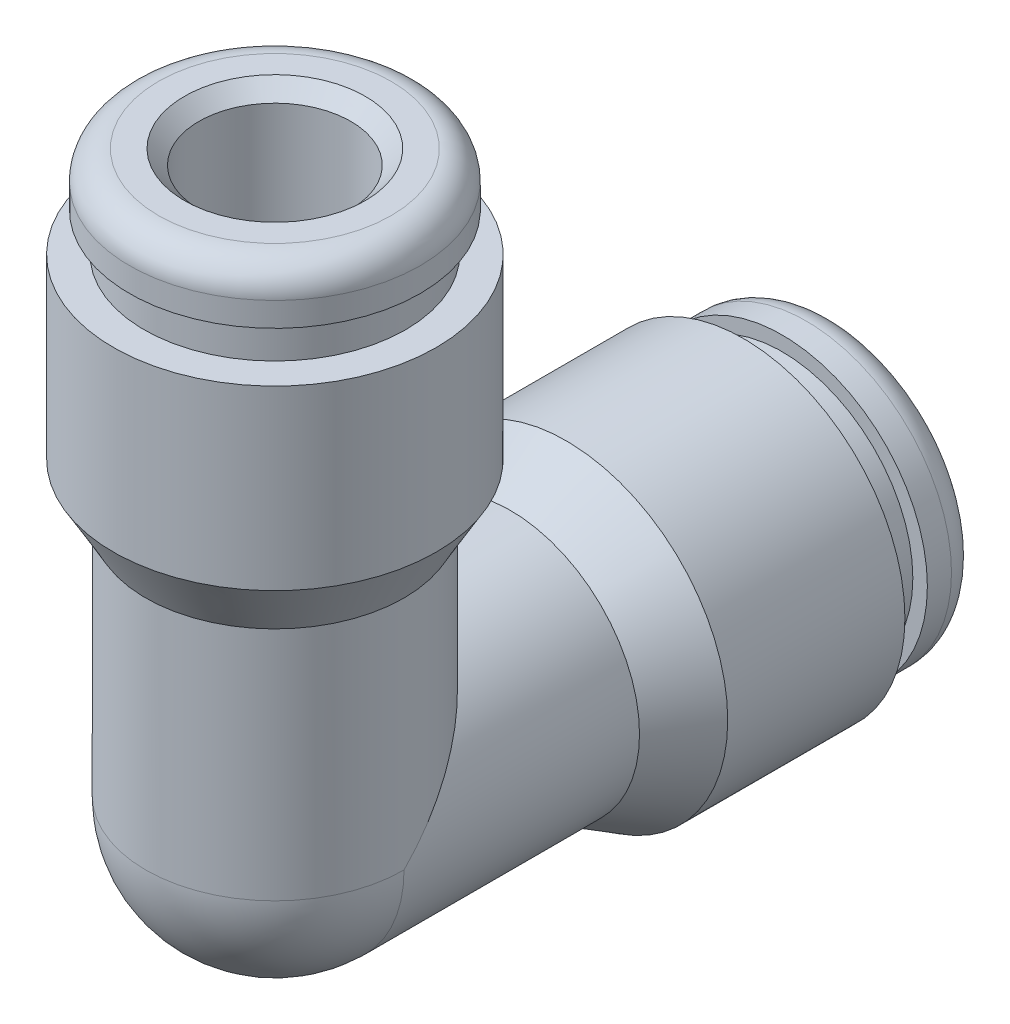
ISO-10303-21;
HEADER;
FILE_DESCRIPTION(('STEP AP214'),'2;1');
FILE_NAME('part.step','',(''),(''),'','','');
FILE_SCHEMA(('AUTOMOTIVE_DESIGN { 1 0 10303 214 1 1 1 1 }'));
ENDSEC;
DATA;
#1=APPLICATION_CONTEXT('core data for automotive mechanical design processes');
#2=APPLICATION_PROTOCOL_DEFINITION('international standard','automotive_design',2000,#1);
#3=PRODUCT_CONTEXT('',#1,'mechanical');
#4=PRODUCT('Part','Part','',(#3));
#5=PRODUCT_RELATED_PRODUCT_CATEGORY('part','',(#4));
#6=PRODUCT_DEFINITION_FORMATION('','',#4);
#7=PRODUCT_DEFINITION_CONTEXT('part definition',#1,'design');
#8=PRODUCT_DEFINITION('design','',#6,#7);
#9=PRODUCT_DEFINITION_SHAPE('','',#8);
#10=(LENGTH_UNIT() NAMED_UNIT(*) SI_UNIT(.MILLI.,.METRE.));
#11=(NAMED_UNIT(*) PLANE_ANGLE_UNIT() SI_UNIT($,.RADIAN.));
#12=(NAMED_UNIT(*) SI_UNIT($,.STERADIAN.) SOLID_ANGLE_UNIT());
#13=UNCERTAINTY_MEASURE_WITH_UNIT(LENGTH_MEASURE(1.E-05),#10,'distance_accuracy_value','');
#14=(GEOMETRIC_REPRESENTATION_CONTEXT(3) GLOBAL_UNCERTAINTY_ASSIGNED_CONTEXT((#13)) GLOBAL_UNIT_ASSIGNED_CONTEXT((#10,
#11,#12)) REPRESENTATION_CONTEXT('',''));
#15=CARTESIAN_POINT('',(0.,0.,0.));
#16=DIRECTION('',(0.,0.,1.));
#17=DIRECTION('',(1.,0.,0.));
#18=AXIS2_PLACEMENT_3D('',#15,#16,#17);
#19=CARTESIAN_POINT('',(0.,0.,0.));
#20=DIRECTION('',(0.,0.,1.));
#21=DIRECTION('',(1.,0.,0.));
#22=AXIS2_PLACEMENT_3D('',#19,#20,#21);
#23=CYLINDRICAL_SURFACE('',#22,1.238);
#24=CARTESIAN_POINT('',(0.,0.,-5.25));
#25=DIRECTION('',(0.,0.,1.));
#26=DIRECTION('',(1.,0.,0.));
#27=AXIS2_PLACEMENT_3D('',#24,#25,#26);
#28=CIRCLE('',#27,1.238);
#29=CARTESIAN_POINT('',(1.238,0.,-5.25));
#30=VERTEX_POINT('',#29);
#31=EDGE_CURVE('E11',#30,#30,#28,.T.);
#32=ORIENTED_EDGE('',*,*,#31,.F.);
#33=EDGE_LOOP('',(#32));
#34=FACE_BOUND('',#33,.T.);
#35=CARTESIAN_POINT('',(0.,0.,0.));
#36=DIRECTION('',(0.,0.707106781186546,0.707106781186549));
#37=DIRECTION('',(0.,-0.707106781186549,0.707106781186546));
#38=AXIS2_PLACEMENT_3D('',#35,#36,#37);
#39=ELLIPSE('',#38,1.75079639021789,1.238);
#40=CARTESIAN_POINT('',(-1.238,0.,0.));
#41=VERTEX_POINT('',#40);
#42=CARTESIAN_POINT('',(1.238,0.,0.));
#43=VERTEX_POINT('',#42);
#44=EDGE_CURVE('E66',#41,#43,#39,.F.);
#45=ORIENTED_EDGE('',*,*,#44,.F.);
#46=CARTESIAN_POINT('',(0.,0.,0.));
#47=DIRECTION('',(0.,0.,-1.));
#48=DIRECTION('',(1.,0.,0.));
#49=AXIS2_PLACEMENT_3D('',#46,#47,#48);
#50=CIRCLE('',#49,1.238);
#51=EDGE_CURVE('E76',#43,#41,#50,.T.);
#52=ORIENTED_EDGE('',*,*,#51,.F.);
#53=EDGE_LOOP('',(#45,#52));
#54=FACE_BOUND('',#53,.T.);
#55=ADVANCED_FACE('F39',(#34,#54),#23,.F.);
#56=CARTESIAN_POINT('',(0.,0.,0.));
#57=DIRECTION('',(0.,0.,1.));
#58=DIRECTION('',(1.,0.,0.));
#59=AXIS2_PLACEMENT_3D('',#56,#57,#58);
#60=CYLINDRICAL_SURFACE('',#59,3.4);
#61=CARTESIAN_POINT('',(0.,0.,-6.2));
#62=DIRECTION('',(0.,0.,1.));
#63=DIRECTION('',(1.,0.,0.));
#64=AXIS2_PLACEMENT_3D('',#61,#62,#63);
#65=CIRCLE('',#64,3.4);
#66=CARTESIAN_POINT('',(3.4,0.,-6.2));
#67=VERTEX_POINT('',#66);
#68=EDGE_CURVE('E48',#67,#67,#65,.T.);
#69=ORIENTED_EDGE('',*,*,#68,.T.);
#70=EDGE_LOOP('',(#69));
#71=FACE_BOUND('',#70,.T.);
#72=CARTESIAN_POINT('',(0.,0.,0.));
#73=DIRECTION('',(0.,0.707106781186546,0.707106781186549));
#74=DIRECTION('',(0.,-0.707106781186549,0.707106781186546));
#75=AXIS2_PLACEMENT_3D('',#72,#73,#74);
#76=ELLIPSE('',#75,4.80832611206851,3.4);
#77=CARTESIAN_POINT('',(3.4,0.,0.));
#78=VERTEX_POINT('',#77);
#79=CARTESIAN_POINT('',(-3.4,0.,0.));
#80=VERTEX_POINT('',#79);
#81=EDGE_CURVE('E85',#78,#80,#76,.T.);
#82=ORIENTED_EDGE('',*,*,#81,.F.);
#83=CARTESIAN_POINT('',(0.,0.,0.));
#84=DIRECTION('',(0.,0.,1.));
#85=DIRECTION('',(1.,0.,0.));
#86=AXIS2_PLACEMENT_3D('',#83,#84,#85);
#87=CIRCLE('',#86,3.4);
#88=EDGE_CURVE('E55',#80,#78,#87,.T.);
#89=ORIENTED_EDGE('',*,*,#88,.F.);
#90=EDGE_LOOP('',(#82,#89));
#91=FACE_BOUND('',#90,.T.);
#92=ADVANCED_FACE('F184',(#71,#91),#60,.T.);
#93=CARTESIAN_POINT('',(0.,2.,-5.25));
#94=DIRECTION('',(0.,0.,1.));
#95=DIRECTION('',(1.,0.,0.));
#96=AXIS2_PLACEMENT_3D('',#93,#94,#95);
#97=PLANE('',#96);
#98=CARTESIAN_POINT('',(0.,0.,-5.25));
#99=DIRECTION('',(0.,0.,1.));
#100=DIRECTION('',(1.,0.,0.));
#101=AXIS2_PLACEMENT_3D('',#98,#99,#100);
#102=CIRCLE('',#101,2.);
#103=CARTESIAN_POINT('',(2.,0.,-5.25));
#104=VERTEX_POINT('',#103);
#105=EDGE_CURVE('E78',#104,#104,#102,.T.);
#106=ORIENTED_EDGE('',*,*,#105,.F.);
#107=EDGE_LOOP('',(#106));
#108=FACE_BOUND('',#107,.T.);
#109=ORIENTED_EDGE('',*,*,#31,.T.);
#110=EDGE_LOOP('',(#109));
#111=FACE_BOUND('',#110,.T.);
#112=ADVANCED_FACE('F41',(#108,#111),#97,.F.);
#113=CARTESIAN_POINT('',(0.,0.,-7.67224318643354));
#114=DIRECTION('',(0.,0.,-1.));
#115=DIRECTION('',(-1.,0.,0.));
#116=AXIS2_PLACEMENT_3D('',#113,#114,#115);
#117=CONICAL_SURFACE('',#116,4.25,0.5235987755983);
#118=ORIENTED_EDGE('',*,*,#68,.F.);
#119=EDGE_LOOP('',(#118));
#120=FACE_BOUND('',#119,.T.);
#121=CARTESIAN_POINT('',(0.,0.,-7.67224318643354));
#122=DIRECTION('',(0.,0.,1.));
#123=DIRECTION('',(1.,0.,0.));
#124=AXIS2_PLACEMENT_3D('',#121,#122,#123);
#125=CIRCLE('',#124,4.25);
#126=CARTESIAN_POINT('',(4.25,0.,-7.67224318643354));
#127=VERTEX_POINT('',#126);
#128=EDGE_CURVE('E121',#127,#127,#125,.T.);
#129=ORIENTED_EDGE('',*,*,#128,.T.);
#130=EDGE_LOOP('',(#129));
#131=FACE_BOUND('',#130,.T.);
#132=ADVANCED_FACE('F193',(#120,#131),#117,.T.);
#133=CARTESIAN_POINT('',(0.,0.,0.));
#134=DIRECTION('',(0.,0.,1.));
#135=DIRECTION('',(1.,0.,0.));
#136=AXIS2_PLACEMENT_3D('',#133,#134,#135);
#137=CYLINDRICAL_SURFACE('',#136,4.25);
#138=ORIENTED_EDGE('',*,*,#128,.F.);
#139=EDGE_LOOP('',(#138));
#140=FACE_BOUND('',#139,.T.);
#141=CARTESIAN_POINT('',(0.,0.,-12.337));
#142=DIRECTION('',(0.,0.,1.));
#143=DIRECTION('',(1.,0.,0.));
#144=AXIS2_PLACEMENT_3D('',#141,#142,#143);
#145=CIRCLE('',#144,4.25);
#146=CARTESIAN_POINT('',(4.25,0.,-12.337));
#147=VERTEX_POINT('',#146);
#148=EDGE_CURVE('E118',#147,#147,#145,.T.);
#149=ORIENTED_EDGE('',*,*,#148,.T.);
#150=EDGE_LOOP('',(#149));
#151=FACE_BOUND('',#150,.T.);
#152=ADVANCED_FACE('F196',(#140,#151),#137,.T.);
#153=CARTESIAN_POINT('',(0.,4.25,-12.337));
#154=DIRECTION('',(0.,0.,1.));
#155=DIRECTION('',(1.,0.,0.));
#156=AXIS2_PLACEMENT_3D('',#153,#154,#155);
#157=PLANE('',#156);
#158=ORIENTED_EDGE('',*,*,#148,.F.);
#159=EDGE_LOOP('',(#158));
#160=FACE_BOUND('',#159,.T.);
#161=CARTESIAN_POINT('',(0.,0.,-12.337));
#162=DIRECTION('',(0.,0.,1.));
#163=DIRECTION('',(1.,0.,0.));
#164=AXIS2_PLACEMENT_3D('',#161,#162,#163);
#165=CIRCLE('',#164,3.4425);
#166=CARTESIAN_POINT('',(3.4425,0.,-12.337));
#167=VERTEX_POINT('',#166);
#168=EDGE_CURVE('E115',#167,#167,#165,.T.);
#169=ORIENTED_EDGE('',*,*,#168,.T.);
#170=EDGE_LOOP('',(#169));
#171=FACE_BOUND('',#170,.T.);
#172=ADVANCED_FACE('F200',(#160,#171),#157,.F.);
#173=CARTESIAN_POINT('',(0.,0.,0.));
#174=DIRECTION('',(0.,0.,1.));
#175=DIRECTION('',(1.,0.,0.));
#176=AXIS2_PLACEMENT_3D('',#173,#174,#175);
#177=CYLINDRICAL_SURFACE('',#176,3.4425);
#178=ORIENTED_EDGE('',*,*,#168,.F.);
#179=EDGE_LOOP('',(#178));
#180=FACE_BOUND('',#179,.T.);
#181=CARTESIAN_POINT('',(0.,0.,-13.353));
#182=DIRECTION('',(0.,0.,1.));
#183=DIRECTION('',(1.,0.,0.));
#184=AXIS2_PLACEMENT_3D('',#181,#182,#183);
#185=CIRCLE('',#184,3.4425);
#186=CARTESIAN_POINT('',(3.4425,0.,-13.353));
#187=VERTEX_POINT('',#186);
#188=EDGE_CURVE('E112',#187,#187,#185,.T.);
#189=ORIENTED_EDGE('',*,*,#188,.T.);
#190=EDGE_LOOP('',(#189));
#191=FACE_BOUND('',#190,.T.);
#192=ADVANCED_FACE('F204',(#180,#191),#177,.T.);
#193=CARTESIAN_POINT('',(0.,3.825,-13.353));
#194=DIRECTION('',(0.,0.,-1.));
#195=DIRECTION('',(-1.,0.,0.));
#196=AXIS2_PLACEMENT_3D('',#193,#194,#195);
#197=PLANE('',#196);
#198=ORIENTED_EDGE('',*,*,#188,.F.);
#199=EDGE_LOOP('',(#198));
#200=FACE_BOUND('',#199,.T.);
#201=CARTESIAN_POINT('',(0.,0.,-13.353));
#202=DIRECTION('',(0.,0.,1.));
#203=DIRECTION('',(1.,0.,0.));
#204=AXIS2_PLACEMENT_3D('',#201,#202,#203);
#205=CIRCLE('',#204,3.825);
#206=CARTESIAN_POINT('',(3.825,0.,-13.353));
#207=VERTEX_POINT('',#206);
#208=EDGE_CURVE('E109',#207,#207,#205,.T.);
#209=ORIENTED_EDGE('',*,*,#208,.T.);
#210=EDGE_LOOP('',(#209));
#211=FACE_BOUND('',#210,.T.);
#212=ADVANCED_FACE('F208',(#200,#211),#197,.F.);
#213=CARTESIAN_POINT('',(0.,0.,0.));
#214=DIRECTION('',(0.,0.,1.));
#215=DIRECTION('',(1.,0.,0.));
#216=AXIS2_PLACEMENT_3D('',#213,#214,#215);
#217=CYLINDRICAL_SURFACE('',#216,3.825);
#218=ORIENTED_EDGE('',*,*,#208,.F.);
#219=EDGE_LOOP('',(#218));
#220=FACE_BOUND('',#219,.T.);
#221=CARTESIAN_POINT('',(0.,0.,-13.988));
#222=DIRECTION('',(0.,0.,1.));
#223=DIRECTION('',(1.,0.,0.));
#224=AXIS2_PLACEMENT_3D('',#221,#222,#223);
#225=CIRCLE('',#224,3.825);
#226=CARTESIAN_POINT('',(3.825,0.,-13.988));
#227=VERTEX_POINT('',#226);
#228=EDGE_CURVE('E106',#227,#227,#225,.T.);
#229=ORIENTED_EDGE('',*,*,#228,.T.);
#230=EDGE_LOOP('',(#229));
#231=FACE_BOUND('',#230,.T.);
#232=ADVANCED_FACE('F212',(#220,#231),#217,.T.);
#233=CARTESIAN_POINT('',(0.,0.,-13.988));
#234=DIRECTION('',(0.,0.,1.));
#235=DIRECTION('',(1.,0.,0.));
#236=AXIS2_PLACEMENT_3D('',#233,#234,#235);
#237=TOROIDAL_SURFACE('',#236,3.063,0.761999999999999);
#238=ORIENTED_EDGE('',*,*,#228,.F.);
#239=EDGE_LOOP('',(#238));
#240=FACE_BOUND('',#239,.T.);
#241=CARTESIAN_POINT('',(0.,0.,-14.75));
#242=DIRECTION('',(0.,0.,1.));
#243=DIRECTION('',(1.,0.,0.));
#244=AXIS2_PLACEMENT_3D('',#241,#242,#243);
#245=CIRCLE('',#244,3.063);
#246=CARTESIAN_POINT('',(3.063,0.,-14.75));
#247=VERTEX_POINT('',#246);
#248=EDGE_CURVE('E103',#247,#247,#245,.T.);
#249=ORIENTED_EDGE('',*,*,#248,.T.);
#250=EDGE_LOOP('',(#249));
#251=FACE_BOUND('',#250,.T.);
#252=ADVANCED_FACE('F216',(#240,#251),#237,.T.);
#253=CARTESIAN_POINT('',(0.,3.063,-14.75));
#254=DIRECTION('',(0.,0.,1.));
#255=DIRECTION('',(1.,0.,0.));
#256=AXIS2_PLACEMENT_3D('',#253,#254,#255);
#257=PLANE('',#256);
#258=ORIENTED_EDGE('',*,*,#248,.F.);
#259=EDGE_LOOP('',(#258));
#260=FACE_BOUND('',#259,.T.);
#261=CARTESIAN_POINT('',(0.,0.,-14.75));
#262=DIRECTION('',(0.,0.,1.));
#263=DIRECTION('',(1.,0.,0.));
#264=AXIS2_PLACEMENT_3D('',#261,#262,#263);
#265=CIRCLE('',#264,2.381);
#266=CARTESIAN_POINT('',(2.381,0.,-14.75));
#267=VERTEX_POINT('',#266);
#268=EDGE_CURVE('E100',#267,#267,#265,.T.);
#269=ORIENTED_EDGE('',*,*,#268,.T.);
#270=EDGE_LOOP('',(#269));
#271=FACE_BOUND('',#270,.T.);
#272=ADVANCED_FACE('F220',(#260,#271),#257,.F.);
#273=CARTESIAN_POINT('',(0.,0.,-14.369));
#274=DIRECTION('',(0.,0.,-1.));
#275=DIRECTION('',(-1.,0.,0.));
#276=AXIS2_PLACEMENT_3D('',#273,#274,#275);
#277=CONICAL_SURFACE('',#276,2.,0.785398163397452);
#278=ORIENTED_EDGE('',*,*,#268,.F.);
#279=EDGE_LOOP('',(#278));
#280=FACE_BOUND('',#279,.T.);
#281=CARTESIAN_POINT('',(0.,0.,-14.369));
#282=DIRECTION('',(0.,0.,1.));
#283=DIRECTION('',(1.,0.,0.));
#284=AXIS2_PLACEMENT_3D('',#281,#282,#283);
#285=CIRCLE('',#284,2.);
#286=CARTESIAN_POINT('',(2.,0.,-14.369));
#287=VERTEX_POINT('',#286);
#288=EDGE_CURVE('E97',#287,#287,#285,.T.);
#289=ORIENTED_EDGE('',*,*,#288,.T.);
#290=EDGE_LOOP('',(#289));
#291=FACE_BOUND('',#290,.T.);
#292=ADVANCED_FACE('F224',(#280,#291),#277,.F.);
#293=CARTESIAN_POINT('',(0.,0.,0.));
#294=DIRECTION('',(0.,0.,1.));
#295=DIRECTION('',(1.,0.,0.));
#296=AXIS2_PLACEMENT_3D('',#293,#294,#295);
#297=CYLINDRICAL_SURFACE('',#296,2.);
#298=ORIENTED_EDGE('',*,*,#288,.F.);
#299=EDGE_LOOP('',(#298));
#300=FACE_BOUND('',#299,.T.);
#301=ORIENTED_EDGE('',*,*,#105,.T.);
#302=EDGE_LOOP('',(#301));
#303=FACE_BOUND('',#302,.T.);
#304=ADVANCED_FACE('F228',(#300,#303),#297,.F.);
#305=CARTESIAN_POINT('',(0.,0.,0.));
#306=DIRECTION('',(1.,0.,0.));
#307=DIRECTION('',(0.,0.,1.));
#308=AXIS2_PLACEMENT_3D('',#305,#306,#307);
#309=SPHERICAL_SURFACE('',#308,3.4);
#310=ORIENTED_EDGE('',*,*,#88,.T.);
#311=CARTESIAN_POINT('',(0.,0.,0.));
#312=DIRECTION('',(0.,-1.,0.));
#313=DIRECTION('',(1.,0.,0.));
#314=AXIS2_PLACEMENT_3D('',#311,#312,#313);
#315=CIRCLE('',#314,3.4);
#316=EDGE_CURVE('E82',#78,#80,#315,.T.);
#317=ORIENTED_EDGE('',*,*,#316,.T.);
#318=EDGE_LOOP('',(#310,#317));
#319=FACE_BOUND('',#318,.T.);
#320=ADVANCED_FACE('F232',(#319),#309,.T.);
#321=CARTESIAN_POINT('',(0.,0.,0.));
#322=DIRECTION('',(1.,0.,0.));
#323=DIRECTION('',(0.,0.,-1.));
#324=AXIS2_PLACEMENT_3D('',#321,#322,#323);
#325=SPHERICAL_SURFACE('',#324,1.238);
#326=ORIENTED_EDGE('',*,*,#51,.T.);
#327=CARTESIAN_POINT('',(0.,0.,0.));
#328=DIRECTION('',(0.,-1.,0.));
#329=DIRECTION('',(1.,0.,0.));
#330=AXIS2_PLACEMENT_3D('',#327,#328,#329);
#331=CIRCLE('',#330,1.238);
#332=EDGE_CURVE('E71',#43,#41,#331,.T.);
#333=ORIENTED_EDGE('',*,*,#332,.F.);
#334=EDGE_LOOP('',(#326,#333));
#335=FACE_BOUND('',#334,.T.);
#336=ADVANCED_FACE('F80',(#335),#325,.F.);
#337=CARTESIAN_POINT('',(0.,0.,0.));
#338=DIRECTION('',(0.,-1.,0.));
#339=DIRECTION('',(1.,0.,0.));
#340=AXIS2_PLACEMENT_3D('',#337,#338,#339);
#341=CYLINDRICAL_SURFACE('',#340,2.);
#342=CARTESIAN_POINT('',(0.,14.369,0.));
#343=DIRECTION('',(0.,-1.,0.));
#344=DIRECTION('',(1.,0.,0.));
#345=AXIS2_PLACEMENT_3D('',#342,#343,#344);
#346=CIRCLE('',#345,2.);
#347=CARTESIAN_POINT('',(2.,14.369,0.));
#348=VERTEX_POINT('',#347);
#349=EDGE_CURVE('E159',#348,#348,#346,.T.);
#350=ORIENTED_EDGE('',*,*,#349,.F.);
#351=EDGE_LOOP('',(#350));
#352=FACE_BOUND('',#351,.T.);
#353=CARTESIAN_POINT('',(0.,5.25,0.));
#354=DIRECTION('',(0.,-1.,0.));
#355=DIRECTION('',(1.,0.,0.));
#356=AXIS2_PLACEMENT_3D('',#353,#354,#355);
#357=CIRCLE('',#356,2.);
#358=CARTESIAN_POINT('',(2.,5.25,0.));
#359=VERTEX_POINT('',#358);
#360=EDGE_CURVE('E74',#359,#359,#357,.T.);
#361=ORIENTED_EDGE('',*,*,#360,.T.);
#362=EDGE_LOOP('',(#361));
#363=FACE_BOUND('',#362,.T.);
#364=ADVANCED_FACE('F167',(#352,#363),#341,.F.);
#365=CARTESIAN_POINT('',(0.,14.369,0.));
#366=DIRECTION('',(0.,1.,0.));
#367=DIRECTION('',(-1.,0.,0.));
#368=AXIS2_PLACEMENT_3D('',#365,#366,#367);
#369=CONICAL_SURFACE('',#368,2.,0.785398163397452);
#370=CARTESIAN_POINT('',(0.,14.75,0.));
#371=DIRECTION('',(0.,-1.,0.));
#372=DIRECTION('',(1.,0.,0.));
#373=AXIS2_PLACEMENT_3D('',#370,#371,#372);
#374=CIRCLE('',#373,2.381);
#375=CARTESIAN_POINT('',(2.381,14.75,0.));
#376=VERTEX_POINT('',#375);
#377=EDGE_CURVE('E156',#376,#376,#374,.T.);
#378=ORIENTED_EDGE('',*,*,#377,.F.);
#379=EDGE_LOOP('',(#378));
#380=FACE_BOUND('',#379,.T.);
#381=ORIENTED_EDGE('',*,*,#349,.T.);
#382=EDGE_LOOP('',(#381));
#383=FACE_BOUND('',#382,.T.);
#384=ADVANCED_FACE('F252',(#380,#383),#369,.F.);
#385=CARTESIAN_POINT('',(0.,14.75,3.06300000000005));
#386=DIRECTION('',(0.,-1.,0.));
#387=DIRECTION('',(1.,0.,0.));
#388=AXIS2_PLACEMENT_3D('',#385,#386,#387);
#389=PLANE('',#388);
#390=CARTESIAN_POINT('',(0.,14.75,0.));
#391=DIRECTION('',(0.,-1.,0.));
#392=DIRECTION('',(1.,0.,0.));
#393=AXIS2_PLACEMENT_3D('',#390,#391,#392);
#394=CIRCLE('',#393,3.063);
#395=CARTESIAN_POINT('',(3.063,14.75,0.));
#396=VERTEX_POINT('',#395);
#397=EDGE_CURVE('E153',#396,#396,#394,.T.);
#398=ORIENTED_EDGE('',*,*,#397,.F.);
#399=EDGE_LOOP('',(#398));
#400=FACE_BOUND('',#399,.T.);
#401=ORIENTED_EDGE('',*,*,#377,.T.);
#402=EDGE_LOOP('',(#401));
#403=FACE_BOUND('',#402,.T.);
#404=ADVANCED_FACE('F261',(#400,#403),#389,.F.);
#405=CARTESIAN_POINT('',(0.,13.988,0.));
#406=DIRECTION('',(0.,-1.,0.));
#407=DIRECTION('',(1.,0.,0.));
#408=AXIS2_PLACEMENT_3D('',#405,#406,#407);
#409=TOROIDAL_SURFACE('',#408,3.063,0.761999999999999);
#410=CARTESIAN_POINT('',(0.,13.988,0.));
#411=DIRECTION('',(0.,-1.,0.));
#412=DIRECTION('',(1.,0.,0.));
#413=AXIS2_PLACEMENT_3D('',#410,#411,#412);
#414=CIRCLE('',#413,3.825);
#415=CARTESIAN_POINT('',(3.825,13.988,0.));
#416=VERTEX_POINT('',#415);
#417=EDGE_CURVE('E150',#416,#416,#414,.T.);
#418=ORIENTED_EDGE('',*,*,#417,.F.);
#419=EDGE_LOOP('',(#418));
#420=FACE_BOUND('',#419,.T.);
#421=ORIENTED_EDGE('',*,*,#397,.T.);
#422=EDGE_LOOP('',(#421));
#423=FACE_BOUND('',#422,.T.);
#424=ADVANCED_FACE('F271',(#420,#423),#409,.T.);
#425=CARTESIAN_POINT('',(0.,0.,0.));
#426=DIRECTION('',(0.,-1.,0.));
#427=DIRECTION('',(1.,0.,0.));
#428=AXIS2_PLACEMENT_3D('',#425,#426,#427);
#429=CYLINDRICAL_SURFACE('',#428,3.825);
#430=CARTESIAN_POINT('',(0.,13.353,0.));
#431=DIRECTION('',(0.,-1.,0.));
#432=DIRECTION('',(1.,0.,0.));
#433=AXIS2_PLACEMENT_3D('',#430,#431,#432);
#434=CIRCLE('',#433,3.825);
#435=CARTESIAN_POINT('',(3.825,13.353,0.));
#436=VERTEX_POINT('',#435);
#437=EDGE_CURVE('E147',#436,#436,#434,.T.);
#438=ORIENTED_EDGE('',*,*,#437,.F.);
#439=EDGE_LOOP('',(#438));
#440=FACE_BOUND('',#439,.T.);
#441=ORIENTED_EDGE('',*,*,#417,.T.);
#442=EDGE_LOOP('',(#441));
#443=FACE_BOUND('',#442,.T.);
#444=ADVANCED_FACE('F279',(#440,#443),#429,.T.);
#445=CARTESIAN_POINT('',(0.,13.353,3.82500000000005));
#446=DIRECTION('',(0.,1.,0.));
#447=DIRECTION('',(-1.,0.,0.));
#448=AXIS2_PLACEMENT_3D('',#445,#446,#447);
#449=PLANE('',#448);
#450=CARTESIAN_POINT('',(0.,13.353,0.));
#451=DIRECTION('',(0.,-1.,0.));
#452=DIRECTION('',(1.,0.,0.));
#453=AXIS2_PLACEMENT_3D('',#450,#451,#452);
#454=CIRCLE('',#453,3.4425);
#455=CARTESIAN_POINT('',(3.4425,13.353,0.));
#456=VERTEX_POINT('',#455);
#457=EDGE_CURVE('E144',#456,#456,#454,.T.);
#458=ORIENTED_EDGE('',*,*,#457,.F.);
#459=EDGE_LOOP('',(#458));
#460=FACE_BOUND('',#459,.T.);
#461=ORIENTED_EDGE('',*,*,#437,.T.);
#462=EDGE_LOOP('',(#461));
#463=FACE_BOUND('',#462,.T.);
#464=ADVANCED_FACE('F286',(#460,#463),#449,.F.);
#465=CARTESIAN_POINT('',(0.,0.,0.));
#466=DIRECTION('',(0.,-1.,0.));
#467=DIRECTION('',(1.,0.,0.));
#468=AXIS2_PLACEMENT_3D('',#465,#466,#467);
#469=CYLINDRICAL_SURFACE('',#468,3.4425);
#470=CARTESIAN_POINT('',(0.,12.337,0.));
#471=DIRECTION('',(0.,-1.,0.));
#472=DIRECTION('',(1.,0.,0.));
#473=AXIS2_PLACEMENT_3D('',#470,#471,#472);
#474=CIRCLE('',#473,3.4425);
#475=CARTESIAN_POINT('',(3.4425,12.337,0.));
#476=VERTEX_POINT('',#475);
#477=EDGE_CURVE('E141',#476,#476,#474,.T.);
#478=ORIENTED_EDGE('',*,*,#477,.F.);
#479=EDGE_LOOP('',(#478));
#480=FACE_BOUND('',#479,.T.);
#481=ORIENTED_EDGE('',*,*,#457,.T.);
#482=EDGE_LOOP('',(#481));
#483=FACE_BOUND('',#482,.T.);
#484=ADVANCED_FACE('F294',(#480,#483),#469,.T.);
#485=CARTESIAN_POINT('',(0.,12.337,4.25000000000004));
#486=DIRECTION('',(0.,-1.,0.));
#487=DIRECTION('',(1.,0.,0.));
#488=AXIS2_PLACEMENT_3D('',#485,#486,#487);
#489=PLANE('',#488);
#490=CARTESIAN_POINT('',(0.,12.337,0.));
#491=DIRECTION('',(0.,-1.,0.));
#492=DIRECTION('',(1.,0.,0.));
#493=AXIS2_PLACEMENT_3D('',#490,#491,#492);
#494=CIRCLE('',#493,4.25);
#495=CARTESIAN_POINT('',(4.25,12.337,0.));
#496=VERTEX_POINT('',#495);
#497=EDGE_CURVE('E138',#496,#496,#494,.T.);
#498=ORIENTED_EDGE('',*,*,#497,.F.);
#499=EDGE_LOOP('',(#498));
#500=FACE_BOUND('',#499,.T.);
#501=ORIENTED_EDGE('',*,*,#477,.T.);
#502=EDGE_LOOP('',(#501));
#503=FACE_BOUND('',#502,.T.);
#504=ADVANCED_FACE('F302',(#500,#503),#489,.F.);
#505=CARTESIAN_POINT('',(0.,0.,0.));
#506=DIRECTION('',(0.,-1.,0.));
#507=DIRECTION('',(1.,0.,0.));
#508=AXIS2_PLACEMENT_3D('',#505,#506,#507);
#509=CYLINDRICAL_SURFACE('',#508,4.25);
#510=CARTESIAN_POINT('',(0.,7.67224318643354,0.));
#511=DIRECTION('',(0.,-1.,0.));
#512=DIRECTION('',(1.,0.,0.));
#513=AXIS2_PLACEMENT_3D('',#510,#511,#512);
#514=CIRCLE('',#513,4.25);
#515=CARTESIAN_POINT('',(4.25,7.67224318643354,0.));
#516=VERTEX_POINT('',#515);
#517=EDGE_CURVE('E135',#516,#516,#514,.T.);
#518=ORIENTED_EDGE('',*,*,#517,.F.);
#519=EDGE_LOOP('',(#518));
#520=FACE_BOUND('',#519,.T.);
#521=ORIENTED_EDGE('',*,*,#497,.T.);
#522=EDGE_LOOP('',(#521));
#523=FACE_BOUND('',#522,.T.);
#524=ADVANCED_FACE('F310',(#520,#523),#509,.T.);
#525=CARTESIAN_POINT('',(0.,7.67224318643354,0.));
#526=DIRECTION('',(0.,1.,0.));
#527=DIRECTION('',(-1.,0.,0.));
#528=AXIS2_PLACEMENT_3D('',#525,#526,#527);
#529=CONICAL_SURFACE('',#528,4.25,0.5235987755983);
#530=CARTESIAN_POINT('',(0.,6.2,0.));
#531=DIRECTION('',(0.,-1.,0.));
#532=DIRECTION('',(1.,0.,0.));
#533=AXIS2_PLACEMENT_3D('',#530,#531,#532);
#534=CIRCLE('',#533,3.4);
#535=CARTESIAN_POINT('',(3.4,6.2,0.));
#536=VERTEX_POINT('',#535);
#537=EDGE_CURVE('E87',#536,#536,#534,.T.);
#538=ORIENTED_EDGE('',*,*,#537,.F.);
#539=EDGE_LOOP('',(#538));
#540=FACE_BOUND('',#539,.T.);
#541=ORIENTED_EDGE('',*,*,#517,.T.);
#542=EDGE_LOOP('',(#541));
#543=FACE_BOUND('',#542,.T.);
#544=ADVANCED_FACE('F173',(#540,#543),#529,.T.);
#545=CARTESIAN_POINT('',(0.,5.24999999999999,2.00000000000002));
#546=DIRECTION('',(0.,-1.,0.));
#547=DIRECTION('',(1.,0.,0.));
#548=AXIS2_PLACEMENT_3D('',#545,#546,#547);
#549=PLANE('',#548);
#550=ORIENTED_EDGE('',*,*,#360,.F.);
#551=EDGE_LOOP('',(#550));
#552=FACE_BOUND('',#551,.T.);
#553=CARTESIAN_POINT('',(0.,5.25,0.));
#554=DIRECTION('',(0.,-1.,0.));
#555=DIRECTION('',(1.,0.,0.));
#556=AXIS2_PLACEMENT_3D('',#553,#554,#555);
#557=CIRCLE('',#556,1.238);
#558=CARTESIAN_POINT('',(1.238,5.25,0.));
#559=VERTEX_POINT('',#558);
#560=EDGE_CURVE('E81',#559,#559,#557,.T.);
#561=ORIENTED_EDGE('',*,*,#560,.T.);
#562=EDGE_LOOP('',(#561));
#563=FACE_BOUND('',#562,.T.);
#564=ADVANCED_FACE('F169',(#552,#563),#549,.F.);
#565=CARTESIAN_POINT('',(0.,0.,0.));
#566=DIRECTION('',(0.,-1.,0.));
#567=DIRECTION('',(1.,0.,0.));
#568=AXIS2_PLACEMENT_3D('',#565,#566,#567);
#569=CYLINDRICAL_SURFACE('',#568,3.4);
#570=ORIENTED_EDGE('',*,*,#537,.T.);
#571=EDGE_LOOP('',(#570));
#572=FACE_BOUND('',#571,.T.);
#573=ORIENTED_EDGE('',*,*,#316,.F.);
#574=ORIENTED_EDGE('',*,*,#81,.T.);
#575=EDGE_LOOP('',(#573,#574));
#576=FACE_BOUND('',#575,.T.);
#577=ADVANCED_FACE('F172',(#572,#576),#569,.T.);
#578=CARTESIAN_POINT('',(0.,0.,0.));
#579=DIRECTION('',(0.,-1.,0.));
#580=DIRECTION('',(1.,0.,0.));
#581=AXIS2_PLACEMENT_3D('',#578,#579,#580);
#582=CYLINDRICAL_SURFACE('',#581,1.238);
#583=ORIENTED_EDGE('',*,*,#44,.T.);
#584=ORIENTED_EDGE('',*,*,#332,.T.);
#585=EDGE_LOOP('',(#583,#584));
#586=FACE_BOUND('',#585,.T.);
#587=ORIENTED_EDGE('',*,*,#560,.F.);
#588=EDGE_LOOP('',(#587));
#589=FACE_BOUND('',#588,.T.);
#590=ADVANCED_FACE('F68',(#586,#589),#582,.F.);
#591=CLOSED_SHELL('',(#55,#92,#112,#132,#152,#172,#192,#212,#232,#252,#272,#292,#304,#320,#336,
#364,#384,#404,#424,#444,#464,#484,#504,#524,#544,#564,#577,#590));
#592=MANIFOLD_SOLID_BREP('B2',#591);
#593=ADVANCED_BREP_SHAPE_REPRESENTATION('',(#18,#592),#14);
#594=SHAPE_DEFINITION_REPRESENTATION(#9,#593);
ENDSEC;
END-ISO-10303-21;
